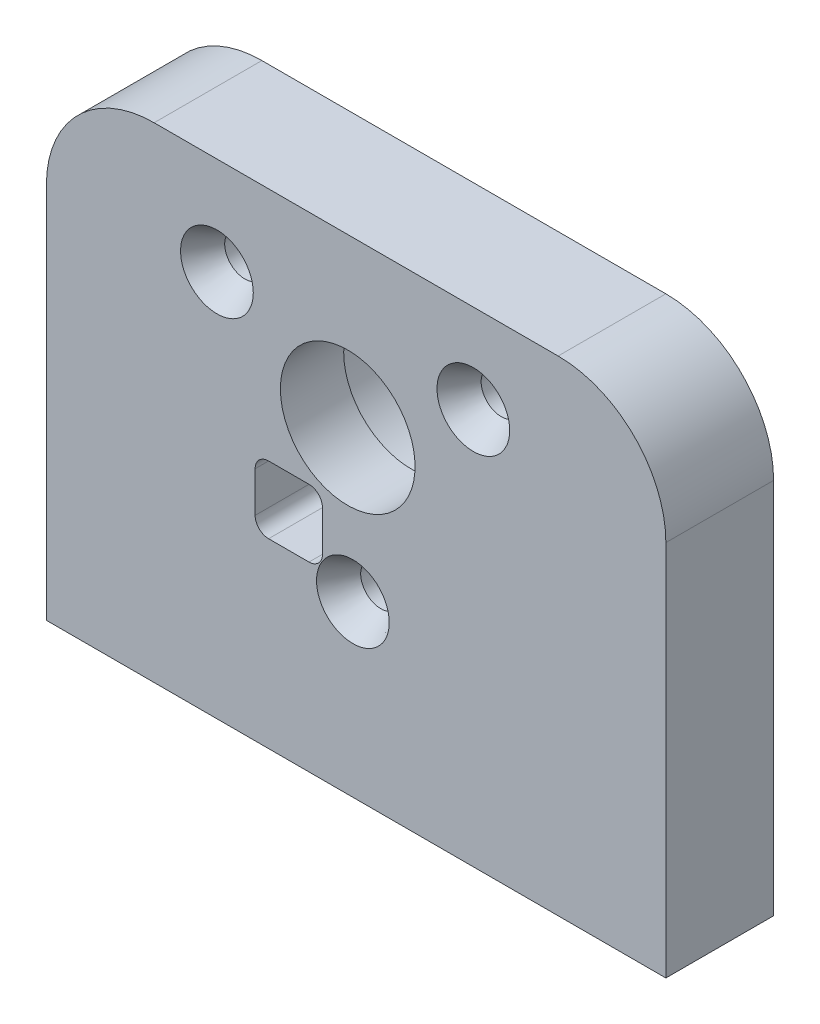
ISO-10303-21;
HEADER;
FILE_DESCRIPTION(('STEP AP214'),'2;1');
FILE_NAME('part.step','',(''),(''),'','','');
FILE_SCHEMA(('AUTOMOTIVE_DESIGN { 1 0 10303 214 1 1 1 1 }'));
ENDSEC;
DATA;
#1=APPLICATION_CONTEXT('core data for automotive mechanical design processes');
#2=APPLICATION_PROTOCOL_DEFINITION('international standard','automotive_design',2000,#1);
#3=PRODUCT_CONTEXT('',#1,'mechanical');
#4=PRODUCT('Part','Part','',(#3));
#5=PRODUCT_RELATED_PRODUCT_CATEGORY('part','',(#4));
#6=PRODUCT_DEFINITION_FORMATION('','',#4);
#7=PRODUCT_DEFINITION_CONTEXT('part definition',#1,'design');
#8=PRODUCT_DEFINITION('design','',#6,#7);
#9=PRODUCT_DEFINITION_SHAPE('','',#8);
#10=(LENGTH_UNIT() NAMED_UNIT(*) SI_UNIT(.MILLI.,.METRE.));
#11=(NAMED_UNIT(*) PLANE_ANGLE_UNIT() SI_UNIT($,.RADIAN.));
#12=(NAMED_UNIT(*) SI_UNIT($,.STERADIAN.) SOLID_ANGLE_UNIT());
#13=UNCERTAINTY_MEASURE_WITH_UNIT(LENGTH_MEASURE(1.E-05),#10,'distance_accuracy_value','');
#14=(GEOMETRIC_REPRESENTATION_CONTEXT(3) GLOBAL_UNCERTAINTY_ASSIGNED_CONTEXT((#13)) GLOBAL_UNIT_ASSIGNED_CONTEXT((#10,
#11,#12)) REPRESENTATION_CONTEXT('',''));
#15=CARTESIAN_POINT('',(0.,0.,0.));
#16=DIRECTION('',(0.,0.,1.));
#17=DIRECTION('',(1.,0.,0.));
#18=AXIS2_PLACEMENT_3D('',#15,#16,#17);
#19=CARTESIAN_POINT('',(-23.,18.,-3.5));
#20=DIRECTION('',(-1.,0.,0.));
#21=DIRECTION('',(0.,0.,1.));
#22=AXIS2_PLACEMENT_3D('',#19,#20,#21);
#23=PLANE('',#22);
#24=DIRECTION('',(0.,-1.,0.));
#25=VECTOR('',#24,1.);
#26=CARTESIAN_POINT('',(-23.,18.,4.5));
#27=LINE('',#26,#25);
#28=CARTESIAN_POINT('',(-23.,10.,4.5));
#29=VERTEX_POINT('',#28);
#30=CARTESIAN_POINT('',(-23.,-18.,4.5));
#31=VERTEX_POINT('',#30);
#32=EDGE_CURVE('E175',#29,#31,#27,.T.);
#33=ORIENTED_EDGE('',*,*,#32,.F.);
#34=DIRECTION('',(0.,0.,1.));
#35=VECTOR('',#34,1.);
#36=CARTESIAN_POINT('',(-23.,10.,-3.5));
#37=LINE('',#36,#35);
#38=CARTESIAN_POINT('',(-23.,10.,-3.5));
#39=VERTEX_POINT('',#38);
#40=EDGE_CURVE('E211',#29,#39,#37,.F.);
#41=ORIENTED_EDGE('',*,*,#40,.T.);
#42=DIRECTION('',(0.,-1.,0.));
#43=VECTOR('',#42,1.);
#44=CARTESIAN_POINT('',(-23.,18.,-3.5));
#45=LINE('',#44,#43);
#46=CARTESIAN_POINT('',(-23.,-18.,-3.5));
#47=VERTEX_POINT('',#46);
#48=EDGE_CURVE('E176',#39,#47,#45,.T.);
#49=ORIENTED_EDGE('',*,*,#48,.T.);
#50=DIRECTION('',(0.,0.,1.));
#51=VECTOR('',#50,1.);
#52=CARTESIAN_POINT('',(-23.,-18.,-3.5));
#53=LINE('',#52,#51);
#54=EDGE_CURVE('E188',#47,#31,#53,.T.);
#55=ORIENTED_EDGE('',*,*,#54,.T.);
#56=EDGE_LOOP('',(#33,#41,#49,#55));
#57=FACE_BOUND('',#56,.T.);
#58=ADVANCED_FACE('F37',(#57),#23,.T.);
#59=CARTESIAN_POINT('',(23.,18.,-3.5));
#60=DIRECTION('',(0.,1.,0.));
#61=DIRECTION('',(0.,0.,1.));
#62=AXIS2_PLACEMENT_3D('',#59,#60,#61);
#63=PLANE('',#62);
#64=DIRECTION('',(-1.,0.,0.));
#65=VECTOR('',#64,1.);
#66=CARTESIAN_POINT('',(23.,18.,-3.5));
#67=LINE('',#66,#65);
#68=CARTESIAN_POINT('',(15.,18.,-3.5));
#69=VERTEX_POINT('',#68);
#70=CARTESIAN_POINT('',(-15.,18.,-3.5));
#71=VERTEX_POINT('',#70);
#72=EDGE_CURVE('E185',#69,#71,#67,.T.);
#73=ORIENTED_EDGE('',*,*,#72,.T.);
#74=DIRECTION('',(0.,0.,1.));
#75=VECTOR('',#74,1.);
#76=CARTESIAN_POINT('',(-15.,18.,-3.5));
#77=LINE('',#76,#75);
#78=CARTESIAN_POINT('',(-15.,18.,4.5));
#79=VERTEX_POINT('',#78);
#80=EDGE_CURVE('E204',#71,#79,#77,.T.);
#81=ORIENTED_EDGE('',*,*,#80,.T.);
#82=DIRECTION('',(-1.,0.,0.));
#83=VECTOR('',#82,1.);
#84=CARTESIAN_POINT('',(23.,18.,4.5));
#85=LINE('',#84,#83);
#86=CARTESIAN_POINT('',(15.,18.,4.5));
#87=VERTEX_POINT('',#86);
#88=EDGE_CURVE('E179',#87,#79,#85,.T.);
#89=ORIENTED_EDGE('',*,*,#88,.F.);
#90=DIRECTION('',(0.,0.,1.));
#91=VECTOR('',#90,1.);
#92=CARTESIAN_POINT('',(15.,18.,-3.5));
#93=LINE('',#92,#91);
#94=EDGE_CURVE('E200',#87,#69,#93,.F.);
#95=ORIENTED_EDGE('',*,*,#94,.T.);
#96=EDGE_LOOP('',(#73,#81,#89,#95));
#97=FACE_BOUND('',#96,.T.);
#98=ADVANCED_FACE('F358',(#97),#63,.T.);
#99=CARTESIAN_POINT('',(23.,-18.,-3.5));
#100=DIRECTION('',(1.,0.,0.));
#101=DIRECTION('',(0.,0.,-1.));
#102=AXIS2_PLACEMENT_3D('',#99,#100,#101);
#103=PLANE('',#102);
#104=DIRECTION('',(0.,1.,0.));
#105=VECTOR('',#104,1.);
#106=CARTESIAN_POINT('',(23.,-18.,-3.5));
#107=LINE('',#106,#105);
#108=CARTESIAN_POINT('',(23.,-18.,-3.5));
#109=VERTEX_POINT('',#108);
#110=CARTESIAN_POINT('',(23.,10.,-3.5));
#111=VERTEX_POINT('',#110);
#112=EDGE_CURVE('E182',#109,#111,#107,.T.);
#113=ORIENTED_EDGE('',*,*,#112,.T.);
#114=DIRECTION('',(0.,0.,1.));
#115=VECTOR('',#114,1.);
#116=CARTESIAN_POINT('',(23.,10.,-3.5));
#117=LINE('',#116,#115);
#118=CARTESIAN_POINT('',(23.,10.,4.5));
#119=VERTEX_POINT('',#118);
#120=EDGE_CURVE('E217',#111,#119,#117,.T.);
#121=ORIENTED_EDGE('',*,*,#120,.T.);
#122=DIRECTION('',(0.,1.,0.));
#123=VECTOR('',#122,1.);
#124=CARTESIAN_POINT('',(23.,-18.,4.5));
#125=LINE('',#124,#123);
#126=CARTESIAN_POINT('',(23.,-18.,4.5));
#127=VERTEX_POINT('',#126);
#128=EDGE_CURVE('E193',#127,#119,#125,.T.);
#129=ORIENTED_EDGE('',*,*,#128,.F.);
#130=DIRECTION('',(0.,0.,1.));
#131=VECTOR('',#130,1.);
#132=CARTESIAN_POINT('',(23.,-18.,-3.5));
#133=LINE('',#132,#131);
#134=EDGE_CURVE('E198',#109,#127,#133,.T.);
#135=ORIENTED_EDGE('',*,*,#134,.F.);
#136=EDGE_LOOP('',(#113,#121,#129,#135));
#137=FACE_BOUND('',#136,.T.);
#138=ADVANCED_FACE('F370',(#137),#103,.T.);
#139=CARTESIAN_POINT('',(-23.,-18.,-3.5));
#140=DIRECTION('',(0.,-1.,0.));
#141=DIRECTION('',(0.,0.,-1.));
#142=AXIS2_PLACEMENT_3D('',#139,#140,#141);
#143=PLANE('',#142);
#144=CARTESIAN_POINT('',(19.,-18.,0.5));
#145=DIRECTION('',(0.,-1.,0.));
#146=DIRECTION('',(0.,0.,-1.));
#147=AXIS2_PLACEMENT_3D('',#144,#145,#146);
#148=CIRCLE('',#147,1.24999999999999);
#149=CARTESIAN_POINT('',(19.,-18.,-0.749999999999991));
#150=VERTEX_POINT('',#149);
#151=EDGE_CURVE('E157',#150,#150,#148,.T.);
#152=ORIENTED_EDGE('',*,*,#151,.F.);
#153=EDGE_LOOP('',(#152));
#154=FACE_BOUND('',#153,.T.);
#155=CARTESIAN_POINT('',(-19.,-18.,0.5));
#156=DIRECTION('',(0.,-1.,0.));
#157=DIRECTION('',(0.,0.,-1.));
#158=AXIS2_PLACEMENT_3D('',#155,#156,#157);
#159=CIRCLE('',#158,1.24999999999999);
#160=CARTESIAN_POINT('',(-19.,-18.,-0.749999999999991));
#161=VERTEX_POINT('',#160);
#162=EDGE_CURVE('E156',#161,#161,#159,.T.);
#163=ORIENTED_EDGE('',*,*,#162,.F.);
#164=EDGE_LOOP('',(#163));
#165=FACE_BOUND('',#164,.T.);
#166=CARTESIAN_POINT('',(0.,-18.,0.5));
#167=DIRECTION('',(0.,-1.,0.));
#168=DIRECTION('',(0.,0.,-1.));
#169=AXIS2_PLACEMENT_3D('',#166,#167,#168);
#170=CIRCLE('',#169,1.24999999999999);
#171=CARTESIAN_POINT('',(0.,-18.,-0.749999999999989));
#172=VERTEX_POINT('',#171);
#173=EDGE_CURVE('E169',#172,#172,#170,.T.);
#174=ORIENTED_EDGE('',*,*,#173,.F.);
#175=EDGE_LOOP('',(#174));
#176=FACE_BOUND('',#175,.T.);
#177=DIRECTION('',(1.,0.,0.));
#178=VECTOR('',#177,1.);
#179=CARTESIAN_POINT('',(-23.,-18.,4.5));
#180=LINE('',#179,#178);
#181=EDGE_CURVE('E190',#31,#127,#180,.T.);
#182=ORIENTED_EDGE('',*,*,#181,.F.);
#183=ORIENTED_EDGE('',*,*,#54,.F.);
#184=DIRECTION('',(1.,0.,0.));
#185=VECTOR('',#184,1.);
#186=CARTESIAN_POINT('',(-23.,-18.,-3.5));
#187=LINE('',#186,#185);
#188=EDGE_CURVE('E178',#47,#109,#187,.T.);
#189=ORIENTED_EDGE('',*,*,#188,.T.);
#190=ORIENTED_EDGE('',*,*,#134,.T.);
#191=EDGE_LOOP('',(#182,#183,#189,#190));
#192=FACE_BOUND('',#191,.T.);
#193=ADVANCED_FACE('F374',(#154,#165,#176,#192),#143,.T.);
#194=CARTESIAN_POINT('',(0.,0.,-3.5));
#195=DIRECTION('',(0.,0.,1.));
#196=DIRECTION('',(1.,0.,0.));
#197=AXIS2_PLACEMENT_3D('',#194,#195,#196);
#198=PLANE('',#197);
#199=CARTESIAN_POINT('',(-10.3374235218715,10.7419094739837,-3.5));
#200=DIRECTION('',(0.,0.,1.));
#201=DIRECTION('',(1.,0.,0.));
#202=AXIS2_PLACEMENT_3D('',#199,#200,#201);
#203=CIRCLE('',#202,1.49999999999999);
#204=CARTESIAN_POINT('',(-8.83742352187153,10.7419094739837,-3.5));
#205=VERTEX_POINT('',#204);
#206=EDGE_CURVE('E41',#205,#205,#203,.T.);
#207=ORIENTED_EDGE('',*,*,#206,.T.);
#208=EDGE_LOOP('',(#207));
#209=FACE_BOUND('',#208,.T.);
#210=CARTESIAN_POINT('',(8.70352905812721,11.4068341899332,-3.5));
#211=DIRECTION('',(0.,0.,1.));
#212=DIRECTION('',(1.,0.,0.));
#213=AXIS2_PLACEMENT_3D('',#210,#211,#212);
#214=CIRCLE('',#213,1.49999999999999);
#215=CARTESIAN_POINT('',(10.2035290581272,11.4068341899332,-3.5));
#216=VERTEX_POINT('',#215);
#217=EDGE_CURVE('E261',#216,#216,#214,.T.);
#218=ORIENTED_EDGE('',*,*,#217,.T.);
#219=EDGE_LOOP('',(#218));
#220=FACE_BOUND('',#219,.T.);
#221=CARTESIAN_POINT('',(-0.241105536255778,-5.41557681457532,-3.5));
#222=DIRECTION('',(0.,0.,1.));
#223=DIRECTION('',(1.,0.,0.));
#224=AXIS2_PLACEMENT_3D('',#221,#222,#223);
#225=CIRCLE('',#224,1.49999999999999);
#226=CARTESIAN_POINT('',(1.25889446374422,-5.41557681457532,-3.5));
#227=VERTEX_POINT('',#226);
#228=EDGE_CURVE('E257',#227,#227,#225,.T.);
#229=ORIENTED_EDGE('',*,*,#228,.T.);
#230=EDGE_LOOP('',(#229));
#231=FACE_BOUND('',#230,.T.);
#232=CARTESIAN_POINT('',(-0.625000000000027,5.57772228311385,-3.5));
#233=DIRECTION('',(0.,0.,-1.));
#234=DIRECTION('',(-1.,0.,0.));
#235=AXIS2_PLACEMENT_3D('',#232,#233,#234);
#236=CIRCLE('',#235,6.00000000000001);
#237=CARTESIAN_POINT('',(-6.62500000000004,5.57772228311385,-3.5));
#238=VERTEX_POINT('',#237);
#239=EDGE_CURVE('E259',#238,#238,#236,.T.);
#240=ORIENTED_EDGE('',*,*,#239,.F.);
#241=EDGE_LOOP('',(#240));
#242=FACE_BOUND('',#241,.T.);
#243=CARTESIAN_POINT('',(-5.,-2.,-3.5));
#244=DIRECTION('',(0.,0.,-1.));
#245=DIRECTION('',(-1.,0.,0.));
#246=AXIS2_PLACEMENT_3D('',#243,#244,#245);
#247=CIRCLE('',#246,2.65);
#248=CARTESIAN_POINT('',(-7.65,-2.,-3.5));
#249=VERTEX_POINT('',#248);
#250=EDGE_CURVE('E291',#249,#249,#247,.T.);
#251=ORIENTED_EDGE('',*,*,#250,.F.);
#252=EDGE_LOOP('',(#251));
#253=FACE_BOUND('',#252,.T.);
#254=ORIENTED_EDGE('',*,*,#48,.F.);
#255=CARTESIAN_POINT('',(-15.,10.,-3.5));
#256=DIRECTION('',(0.,0.,1.));
#257=DIRECTION('',(1.,0.,0.));
#258=AXIS2_PLACEMENT_3D('',#255,#256,#257);
#259=CIRCLE('',#258,8.);
#260=EDGE_CURVE('E215',#39,#71,#259,.F.);
#261=ORIENTED_EDGE('',*,*,#260,.T.);
#262=ORIENTED_EDGE('',*,*,#72,.F.);
#263=CARTESIAN_POINT('',(15.,10.,-3.5));
#264=DIRECTION('',(0.,0.,1.));
#265=DIRECTION('',(1.,0.,0.));
#266=AXIS2_PLACEMENT_3D('',#263,#264,#265);
#267=CIRCLE('',#266,8.);
#268=EDGE_CURVE('E213',#69,#111,#267,.F.);
#269=ORIENTED_EDGE('',*,*,#268,.T.);
#270=ORIENTED_EDGE('',*,*,#112,.F.);
#271=ORIENTED_EDGE('',*,*,#188,.F.);
#272=EDGE_LOOP('',(#254,#261,#262,#269,#270,#271));
#273=FACE_BOUND('',#272,.T.);
#274=ADVANCED_FACE('F351',(#209,#220,#231,#242,#253,#273),#198,.F.);
#275=CARTESIAN_POINT('',(0.,0.,4.5));
#276=DIRECTION('',(0.,0.,1.));
#277=DIRECTION('',(1.,0.,0.));
#278=AXIS2_PLACEMENT_3D('',#275,#276,#277);
#279=PLANE('',#278);
#280=CARTESIAN_POINT('',(-10.3374235218715,10.7419094739837,4.5));
#281=DIRECTION('',(0.,0.,1.));
#282=DIRECTION('',(1.,0.,0.));
#283=AXIS2_PLACEMENT_3D('',#280,#281,#282);
#284=CIRCLE('',#283,2.7);
#285=CARTESIAN_POINT('',(-7.63742352187152,10.7419094739837,4.5));
#286=VERTEX_POINT('',#285);
#287=EDGE_CURVE('E641',#286,#286,#284,.T.);
#288=ORIENTED_EDGE('',*,*,#287,.F.);
#289=EDGE_LOOP('',(#288));
#290=FACE_BOUND('',#289,.T.);
#291=CARTESIAN_POINT('',(8.70352905812721,11.4068341899332,4.5));
#292=DIRECTION('',(0.,0.,1.));
#293=DIRECTION('',(1.,0.,0.));
#294=AXIS2_PLACEMENT_3D('',#291,#292,#293);
#295=CIRCLE('',#294,2.7);
#296=CARTESIAN_POINT('',(11.4035290581272,11.4068341899332,4.5));
#297=VERTEX_POINT('',#296);
#298=EDGE_CURVE('E270',#297,#297,#295,.T.);
#299=ORIENTED_EDGE('',*,*,#298,.F.);
#300=EDGE_LOOP('',(#299));
#301=FACE_BOUND('',#300,.T.);
#302=CARTESIAN_POINT('',(-0.241105536255778,-5.41557681457532,4.5));
#303=DIRECTION('',(0.,0.,1.));
#304=DIRECTION('',(1.,0.,0.));
#305=AXIS2_PLACEMENT_3D('',#302,#303,#304);
#306=CIRCLE('',#305,2.7);
#307=CARTESIAN_POINT('',(2.45889446374422,-5.41557681457532,4.5));
#308=VERTEX_POINT('',#307);
#309=EDGE_CURVE('E263',#308,#308,#306,.T.);
#310=ORIENTED_EDGE('',*,*,#309,.F.);
#311=EDGE_LOOP('',(#310));
#312=FACE_BOUND('',#311,.T.);
#313=CARTESIAN_POINT('',(-0.625000000000027,5.57772228311385,4.5));
#314=DIRECTION('',(0.,0.,-1.));
#315=DIRECTION('',(-1.,0.,0.));
#316=AXIS2_PLACEMENT_3D('',#313,#314,#315);
#317=CIRCLE('',#316,5.00000000000001);
#318=CARTESIAN_POINT('',(-5.62500000000004,5.57772228311385,4.5));
#319=VERTEX_POINT('',#318);
#320=EDGE_CURVE('E288',#319,#319,#317,.T.);
#321=ORIENTED_EDGE('',*,*,#320,.T.);
#322=EDGE_LOOP('',(#321));
#323=FACE_BOUND('',#322,.T.);
#324=DIRECTION('',(0.,1.,0.));
#325=VECTOR('',#324,1.);
#326=CARTESIAN_POINT('',(-2.5,-4.5,4.5));
#327=LINE('',#326,#325);
#328=CARTESIAN_POINT('',(-2.5,-3.5,4.5));
#329=VERTEX_POINT('',#328);
#330=CARTESIAN_POINT('',(-2.5,-0.500000000000002,4.5));
#331=VERTEX_POINT('',#330);
#332=EDGE_CURVE('E224',#329,#331,#327,.T.);
#333=ORIENTED_EDGE('',*,*,#332,.F.);
#334=CARTESIAN_POINT('',(-3.5,-3.5,4.5));
#335=DIRECTION('',(0.,0.,1.));
#336=DIRECTION('',(1.,0.,0.));
#337=AXIS2_PLACEMENT_3D('',#334,#335,#336);
#338=CIRCLE('',#337,1.);
#339=CARTESIAN_POINT('',(-3.5,-4.5,4.5));
#340=VERTEX_POINT('',#339);
#341=EDGE_CURVE('E254',#329,#340,#338,.F.);
#342=ORIENTED_EDGE('',*,*,#341,.T.);
#343=DIRECTION('',(1.,0.,0.));
#344=VECTOR('',#343,1.);
#345=CARTESIAN_POINT('',(-7.5,-4.5,4.5));
#346=LINE('',#345,#344);
#347=CARTESIAN_POINT('',(-6.5,-4.5,4.5));
#348=VERTEX_POINT('',#347);
#349=EDGE_CURVE('E300',#348,#340,#346,.T.);
#350=ORIENTED_EDGE('',*,*,#349,.F.);
#351=CARTESIAN_POINT('',(-6.5,-3.5,4.5));
#352=DIRECTION('',(0.,0.,1.));
#353=DIRECTION('',(1.,0.,0.));
#354=AXIS2_PLACEMENT_3D('',#351,#352,#353);
#355=CIRCLE('',#354,1.);
#356=CARTESIAN_POINT('',(-7.5,-3.5,4.5));
#357=VERTEX_POINT('',#356);
#358=EDGE_CURVE('E252',#348,#357,#355,.F.);
#359=ORIENTED_EDGE('',*,*,#358,.T.);
#360=DIRECTION('',(0.,-1.,0.));
#361=VECTOR('',#360,1.);
#362=CARTESIAN_POINT('',(-7.5,-4.5,4.5));
#363=LINE('',#362,#361);
#364=CARTESIAN_POINT('',(-7.5,-0.500000000000002,4.5));
#365=VERTEX_POINT('',#364);
#366=EDGE_CURVE('E312',#365,#357,#363,.T.);
#367=ORIENTED_EDGE('',*,*,#366,.F.);
#368=CARTESIAN_POINT('',(-6.5,-0.500000000000002,4.5));
#369=DIRECTION('',(0.,0.,1.));
#370=DIRECTION('',(1.,0.,0.));
#371=AXIS2_PLACEMENT_3D('',#368,#369,#370);
#372=CIRCLE('',#371,1.);
#373=CARTESIAN_POINT('',(-6.5,0.499999999999998,4.5));
#374=VERTEX_POINT('',#373);
#375=EDGE_CURVE('E11',#365,#374,#372,.F.);
#376=ORIENTED_EDGE('',*,*,#375,.T.);
#377=DIRECTION('',(-1.,0.,0.));
#378=VECTOR('',#377,1.);
#379=CARTESIAN_POINT('',(-7.5,0.499999999999998,4.5));
#380=LINE('',#379,#378);
#381=CARTESIAN_POINT('',(-3.5,0.499999999999998,4.5));
#382=VERTEX_POINT('',#381);
#383=EDGE_CURVE('E310',#382,#374,#380,.T.);
#384=ORIENTED_EDGE('',*,*,#383,.F.);
#385=CARTESIAN_POINT('',(-3.5,-0.500000000000002,4.5));
#386=DIRECTION('',(0.,0.,1.));
#387=DIRECTION('',(1.,0.,0.));
#388=AXIS2_PLACEMENT_3D('',#385,#386,#387);
#389=CIRCLE('',#388,1.);
#390=EDGE_CURVE('E46',#382,#331,#389,.F.);
#391=ORIENTED_EDGE('',*,*,#390,.T.);
#392=EDGE_LOOP('',(#333,#342,#350,#359,#367,#376,#384,#391));
#393=FACE_BOUND('',#392,.T.);
#394=ORIENTED_EDGE('',*,*,#88,.T.);
#395=CARTESIAN_POINT('',(-15.,10.,4.5));
#396=DIRECTION('',(0.,0.,1.));
#397=DIRECTION('',(1.,0.,0.));
#398=AXIS2_PLACEMENT_3D('',#395,#396,#397);
#399=CIRCLE('',#398,8.);
#400=EDGE_CURVE('E209',#79,#29,#399,.T.);
#401=ORIENTED_EDGE('',*,*,#400,.T.);
#402=ORIENTED_EDGE('',*,*,#32,.T.);
#403=ORIENTED_EDGE('',*,*,#181,.T.);
#404=ORIENTED_EDGE('',*,*,#128,.T.);
#405=CARTESIAN_POINT('',(15.,10.,4.5));
#406=DIRECTION('',(0.,0.,1.));
#407=DIRECTION('',(1.,0.,0.));
#408=AXIS2_PLACEMENT_3D('',#405,#406,#407);
#409=CIRCLE('',#408,8.);
#410=EDGE_CURVE('E207',#119,#87,#409,.T.);
#411=ORIENTED_EDGE('',*,*,#410,.T.);
#412=EDGE_LOOP('',(#394,#401,#402,#403,#404,#411));
#413=FACE_BOUND('',#412,.T.);
#414=ADVANCED_FACE('F347',(#290,#301,#312,#323,#393,#413),#279,.T.);
#415=CARTESIAN_POINT('',(0.,-10.5,0.5));
#416=DIRECTION('',(0.,-1.,0.));
#417=DIRECTION('',(0.,0.,-1.));
#418=AXIS2_PLACEMENT_3D('',#415,#416,#417);
#419=CONICAL_SURFACE('',#418,1.24999999999999,1.02974425867665);
#420=CARTESIAN_POINT('',(0.,-9.74892422621555,0.5));
#421=VERTEX_POINT('',#420);
#422=VERTEX_LOOP('',#421);
#423=FACE_BOUND('',#422,.T.);
#424=CARTESIAN_POINT('',(0.,-10.5,0.5));
#425=DIRECTION('',(0.,-1.,0.));
#426=DIRECTION('',(0.,0.,-1.));
#427=AXIS2_PLACEMENT_3D('',#424,#425,#426);
#428=CIRCLE('',#427,1.24999999999999);
#429=CARTESIAN_POINT('',(0.,-10.5,-0.749999999999987));
#430=VERTEX_POINT('',#429);
#431=EDGE_CURVE('E172',#430,#430,#428,.T.);
#432=ORIENTED_EDGE('',*,*,#431,.T.);
#433=EDGE_LOOP('',(#432));
#434=FACE_BOUND('',#433,.T.);
#435=ADVANCED_FACE('F350',(#423,#434),#419,.F.);
#436=CARTESIAN_POINT('',(0.,-18.,0.5));
#437=DIRECTION('',(0.,-1.,0.));
#438=DIRECTION('',(0.,0.,-1.));
#439=AXIS2_PLACEMENT_3D('',#436,#437,#438);
#440=CYLINDRICAL_SURFACE('',#439,1.24999999999999);
#441=ORIENTED_EDGE('',*,*,#431,.F.);
#442=EDGE_LOOP('',(#441));
#443=FACE_BOUND('',#442,.T.);
#444=ORIENTED_EDGE('',*,*,#173,.T.);
#445=EDGE_LOOP('',(#444));
#446=FACE_BOUND('',#445,.T.);
#447=ADVANCED_FACE('F445',(#443,#446),#440,.F.);
#448=CARTESIAN_POINT('',(-19.,-10.5,0.5));
#449=DIRECTION('',(0.,-1.,0.));
#450=DIRECTION('',(0.,0.,-1.));
#451=AXIS2_PLACEMENT_3D('',#448,#449,#450);
#452=CONICAL_SURFACE('',#451,1.24999999999999,1.02974425867664);
#453=CARTESIAN_POINT('',(-19.,-9.74892422621555,0.5));
#454=VERTEX_POINT('',#453);
#455=VERTEX_LOOP('',#454);
#456=FACE_BOUND('',#455,.T.);
#457=CARTESIAN_POINT('',(-19.,-10.5,0.5));
#458=DIRECTION('',(0.,-1.,0.));
#459=DIRECTION('',(0.,0.,-1.));
#460=AXIS2_PLACEMENT_3D('',#457,#458,#459);
#461=CIRCLE('',#460,1.24999999999999);
#462=CARTESIAN_POINT('',(-19.,-10.5,-0.749999999999987));
#463=VERTEX_POINT('',#462);
#464=EDGE_CURVE('E160',#463,#463,#461,.T.);
#465=ORIENTED_EDGE('',*,*,#464,.T.);
#466=EDGE_LOOP('',(#465));
#467=FACE_BOUND('',#466,.T.);
#468=ADVANCED_FACE('F441',(#456,#467),#452,.F.);
#469=CARTESIAN_POINT('',(-19.,-18.,0.5));
#470=DIRECTION('',(0.,-1.,0.));
#471=DIRECTION('',(0.,0.,-1.));
#472=AXIS2_PLACEMENT_3D('',#469,#470,#471);
#473=CYLINDRICAL_SURFACE('',#472,1.24999999999999);
#474=ORIENTED_EDGE('',*,*,#464,.F.);
#475=EDGE_LOOP('',(#474));
#476=FACE_BOUND('',#475,.T.);
#477=ORIENTED_EDGE('',*,*,#162,.T.);
#478=EDGE_LOOP('',(#477));
#479=FACE_BOUND('',#478,.T.);
#480=ADVANCED_FACE('F150',(#476,#479),#473,.F.);
#481=CARTESIAN_POINT('',(19.,-10.5,0.5));
#482=DIRECTION('',(0.,-1.,0.));
#483=DIRECTION('',(0.,0.,-1.));
#484=AXIS2_PLACEMENT_3D('',#481,#482,#483);
#485=CONICAL_SURFACE('',#484,1.24999999999999,1.02974425867664);
#486=CARTESIAN_POINT('',(19.,-9.74892422621555,0.5));
#487=VERTEX_POINT('',#486);
#488=VERTEX_LOOP('',#487);
#489=FACE_BOUND('',#488,.T.);
#490=CARTESIAN_POINT('',(19.,-10.5,0.5));
#491=DIRECTION('',(0.,-1.,0.));
#492=DIRECTION('',(0.,0.,-1.));
#493=AXIS2_PLACEMENT_3D('',#490,#491,#492);
#494=CIRCLE('',#493,1.24999999999999);
#495=CARTESIAN_POINT('',(19.,-10.5,-0.749999999999987));
#496=VERTEX_POINT('',#495);
#497=EDGE_CURVE('E154',#496,#496,#494,.T.);
#498=ORIENTED_EDGE('',*,*,#497,.T.);
#499=EDGE_LOOP('',(#498));
#500=FACE_BOUND('',#499,.T.);
#501=ADVANCED_FACE('F146',(#489,#500),#485,.F.);
#502=CARTESIAN_POINT('',(19.,-18.,0.5));
#503=DIRECTION('',(0.,-1.,0.));
#504=DIRECTION('',(0.,0.,-1.));
#505=AXIS2_PLACEMENT_3D('',#502,#503,#504);
#506=CYLINDRICAL_SURFACE('',#505,1.24999999999999);
#507=ORIENTED_EDGE('',*,*,#497,.F.);
#508=EDGE_LOOP('',(#507));
#509=FACE_BOUND('',#508,.T.);
#510=ORIENTED_EDGE('',*,*,#151,.T.);
#511=EDGE_LOOP('',(#510));
#512=FACE_BOUND('',#511,.T.);
#513=ADVANCED_FACE('F149',(#509,#512),#506,.F.);
#514=CARTESIAN_POINT('',(-15.,10.,-3.5));
#515=DIRECTION('',(0.,0.,1.));
#516=DIRECTION('',(1.,0.,0.));
#517=AXIS2_PLACEMENT_3D('',#514,#515,#516);
#518=CYLINDRICAL_SURFACE('',#517,8.);
#519=ORIENTED_EDGE('',*,*,#260,.F.);
#520=ORIENTED_EDGE('',*,*,#40,.F.);
#521=ORIENTED_EDGE('',*,*,#400,.F.);
#522=ORIENTED_EDGE('',*,*,#80,.F.);
#523=EDGE_LOOP('',(#519,#520,#521,#522));
#524=FACE_BOUND('',#523,.T.);
#525=ADVANCED_FACE('F380',(#524),#518,.T.);
#526=CARTESIAN_POINT('',(15.,10.,-3.5));
#527=DIRECTION('',(0.,0.,1.));
#528=DIRECTION('',(1.,0.,0.));
#529=AXIS2_PLACEMENT_3D('',#526,#527,#528);
#530=CYLINDRICAL_SURFACE('',#529,8.);
#531=ORIENTED_EDGE('',*,*,#268,.F.);
#532=ORIENTED_EDGE('',*,*,#94,.F.);
#533=ORIENTED_EDGE('',*,*,#410,.F.);
#534=ORIENTED_EDGE('',*,*,#120,.F.);
#535=EDGE_LOOP('',(#531,#532,#533,#534));
#536=FACE_BOUND('',#535,.T.);
#537=ADVANCED_FACE('F363',(#536),#530,.T.);
#538=CARTESIAN_POINT('',(-2.5,-4.5,0.));
#539=DIRECTION('',(1.,0.,0.));
#540=DIRECTION('',(0.,0.,-1.));
#541=AXIS2_PLACEMENT_3D('',#538,#539,#540);
#542=PLANE('',#541);
#543=DIRECTION('',(0.,1.,0.));
#544=VECTOR('',#543,1.);
#545=CARTESIAN_POINT('',(-2.5,-4.5,0.));
#546=LINE('',#545,#544);
#547=CARTESIAN_POINT('',(-2.5,-3.5,0.));
#548=VERTEX_POINT('',#547);
#549=CARTESIAN_POINT('',(-2.5,-0.500000000000002,0.));
#550=VERTEX_POINT('',#549);
#551=EDGE_CURVE('E296',#548,#550,#546,.T.);
#552=ORIENTED_EDGE('',*,*,#551,.F.);
#553=DIRECTION('',(0.,0.,1.));
#554=VECTOR('',#553,1.);
#555=CARTESIAN_POINT('',(-2.5,-3.5,4.5));
#556=LINE('',#555,#554);
#557=EDGE_CURVE('E245',#548,#329,#556,.T.);
#558=ORIENTED_EDGE('',*,*,#557,.T.);
#559=ORIENTED_EDGE('',*,*,#332,.T.);
#560=DIRECTION('',(0.,0.,1.));
#561=VECTOR('',#560,1.);
#562=CARTESIAN_POINT('',(-2.5,-0.500000000000002,0.));
#563=LINE('',#562,#561);
#564=EDGE_CURVE('E243',#331,#550,#563,.F.);
#565=ORIENTED_EDGE('',*,*,#564,.T.);
#566=EDGE_LOOP('',(#552,#558,#559,#565));
#567=FACE_BOUND('',#566,.T.);
#568=ADVANCED_FACE('F330',(#567),#542,.F.);
#569=CARTESIAN_POINT('',(-7.5,-4.5,0.));
#570=DIRECTION('',(0.,-1.,0.));
#571=DIRECTION('',(0.,0.,-1.));
#572=AXIS2_PLACEMENT_3D('',#569,#570,#571);
#573=PLANE('',#572);
#574=DIRECTION('',(1.,0.,0.));
#575=VECTOR('',#574,1.);
#576=CARTESIAN_POINT('',(-7.5,-4.5,0.));
#577=LINE('',#576,#575);
#578=CARTESIAN_POINT('',(-6.5,-4.5,0.));
#579=VERTEX_POINT('',#578);
#580=CARTESIAN_POINT('',(-3.5,-4.5,0.));
#581=VERTEX_POINT('',#580);
#582=EDGE_CURVE('E163',#579,#581,#577,.T.);
#583=ORIENTED_EDGE('',*,*,#582,.F.);
#584=DIRECTION('',(0.,0.,1.));
#585=VECTOR('',#584,1.);
#586=CARTESIAN_POINT('',(-6.5,-4.5,4.5));
#587=LINE('',#586,#585);
#588=EDGE_CURVE('E227',#579,#348,#587,.T.);
#589=ORIENTED_EDGE('',*,*,#588,.T.);
#590=ORIENTED_EDGE('',*,*,#349,.T.);
#591=DIRECTION('',(0.,0.,1.));
#592=VECTOR('',#591,1.);
#593=CARTESIAN_POINT('',(-3.5,-4.5,0.));
#594=LINE('',#593,#592);
#595=EDGE_CURVE('E220',#340,#581,#594,.F.);
#596=ORIENTED_EDGE('',*,*,#595,.T.);
#597=EDGE_LOOP('',(#583,#589,#590,#596));
#598=FACE_BOUND('',#597,.T.);
#599=ADVANCED_FACE('F319',(#598),#573,.F.);
#600=CARTESIAN_POINT('',(-7.5,-4.5,0.));
#601=DIRECTION('',(-1.,0.,0.));
#602=DIRECTION('',(0.,0.,1.));
#603=AXIS2_PLACEMENT_3D('',#600,#601,#602);
#604=PLANE('',#603);
#605=ORIENTED_EDGE('',*,*,#366,.T.);
#606=DIRECTION('',(0.,0.,1.));
#607=VECTOR('',#606,1.);
#608=CARTESIAN_POINT('',(-7.5,-3.5,0.));
#609=LINE('',#608,#607);
#610=CARTESIAN_POINT('',(-7.5,-3.5,0.));
#611=VERTEX_POINT('',#610);
#612=EDGE_CURVE('E233',#357,#611,#609,.F.);
#613=ORIENTED_EDGE('',*,*,#612,.T.);
#614=DIRECTION('',(0.,-1.,0.));
#615=VECTOR('',#614,1.);
#616=CARTESIAN_POINT('',(-7.5,-4.5,0.));
#617=LINE('',#616,#615);
#618=CARTESIAN_POINT('',(-7.5,-0.500000000000002,0.));
#619=VERTEX_POINT('',#618);
#620=EDGE_CURVE('E303',#619,#611,#617,.T.);
#621=ORIENTED_EDGE('',*,*,#620,.F.);
#622=DIRECTION('',(0.,0.,1.));
#623=VECTOR('',#622,1.);
#624=CARTESIAN_POINT('',(-7.5,-0.500000000000002,4.5));
#625=LINE('',#624,#623);
#626=EDGE_CURVE('E230',#619,#365,#625,.T.);
#627=ORIENTED_EDGE('',*,*,#626,.T.);
#628=EDGE_LOOP('',(#605,#613,#621,#627));
#629=FACE_BOUND('',#628,.T.);
#630=ADVANCED_FACE('F343',(#629),#604,.F.);
#631=CARTESIAN_POINT('',(-7.5,0.499999999999998,0.));
#632=DIRECTION('',(0.,1.,0.));
#633=DIRECTION('',(0.,0.,1.));
#634=AXIS2_PLACEMENT_3D('',#631,#632,#633);
#635=PLANE('',#634);
#636=DIRECTION('',(-1.,0.,0.));
#637=VECTOR('',#636,1.);
#638=CARTESIAN_POINT('',(-7.5,0.499999999999998,0.));
#639=LINE('',#638,#637);
#640=CARTESIAN_POINT('',(-3.5,0.499999999999998,0.));
#641=VERTEX_POINT('',#640);
#642=CARTESIAN_POINT('',(-6.5,0.499999999999998,0.));
#643=VERTEX_POINT('',#642);
#644=EDGE_CURVE('E299',#641,#643,#639,.T.);
#645=ORIENTED_EDGE('',*,*,#644,.F.);
#646=DIRECTION('',(0.,0.,1.));
#647=VECTOR('',#646,1.);
#648=CARTESIAN_POINT('',(-3.5,0.499999999999998,4.5));
#649=LINE('',#648,#647);
#650=EDGE_CURVE('E250',#641,#382,#649,.T.);
#651=ORIENTED_EDGE('',*,*,#650,.T.);
#652=ORIENTED_EDGE('',*,*,#383,.T.);
#653=DIRECTION('',(0.,0.,1.));
#654=VECTOR('',#653,1.);
#655=CARTESIAN_POINT('',(-6.5,0.499999999999998,0.));
#656=LINE('',#655,#654);
#657=EDGE_CURVE('E248',#374,#643,#656,.F.);
#658=ORIENTED_EDGE('',*,*,#657,.T.);
#659=EDGE_LOOP('',(#645,#651,#652,#658));
#660=FACE_BOUND('',#659,.T.);
#661=ADVANCED_FACE('F336',(#660),#635,.F.);
#662=CARTESIAN_POINT('',(0.,0.,0.));
#663=DIRECTION('',(0.,0.,-1.));
#664=DIRECTION('',(-1.,0.,0.));
#665=AXIS2_PLACEMENT_3D('',#662,#663,#664);
#666=PLANE('',#665);
#667=CARTESIAN_POINT('',(-5.,-2.,0.));
#668=DIRECTION('',(0.,0.,-1.));
#669=DIRECTION('',(-1.,0.,0.));
#670=AXIS2_PLACEMENT_3D('',#667,#668,#669);
#671=CIRCLE('',#670,1.49999999999999);
#672=CARTESIAN_POINT('',(-6.49999999999999,-2.,0.));
#673=VERTEX_POINT('',#672);
#674=EDGE_CURVE('E221',#673,#673,#671,.T.);
#675=ORIENTED_EDGE('',*,*,#674,.T.);
#676=EDGE_LOOP('',(#675));
#677=FACE_BOUND('',#676,.T.);
#678=ORIENTED_EDGE('',*,*,#620,.T.);
#679=CARTESIAN_POINT('',(-6.5,-3.5,0.));
#680=DIRECTION('',(0.,0.,-1.));
#681=DIRECTION('',(-1.,0.,0.));
#682=AXIS2_PLACEMENT_3D('',#679,#680,#681);
#683=CIRCLE('',#682,1.);
#684=EDGE_CURVE('E241',#611,#579,#683,.F.);
#685=ORIENTED_EDGE('',*,*,#684,.T.);
#686=ORIENTED_EDGE('',*,*,#582,.T.);
#687=CARTESIAN_POINT('',(-3.5,-3.5,0.));
#688=DIRECTION('',(0.,0.,-1.));
#689=DIRECTION('',(-1.,0.,0.));
#690=AXIS2_PLACEMENT_3D('',#687,#688,#689);
#691=CIRCLE('',#690,1.);
#692=EDGE_CURVE('E239',#581,#548,#691,.F.);
#693=ORIENTED_EDGE('',*,*,#692,.T.);
#694=ORIENTED_EDGE('',*,*,#551,.T.);
#695=CARTESIAN_POINT('',(-3.5,-0.500000000000002,0.));
#696=DIRECTION('',(0.,0.,-1.));
#697=DIRECTION('',(-1.,0.,0.));
#698=AXIS2_PLACEMENT_3D('',#695,#696,#697);
#699=CIRCLE('',#698,1.);
#700=EDGE_CURVE('E237',#550,#641,#699,.F.);
#701=ORIENTED_EDGE('',*,*,#700,.T.);
#702=ORIENTED_EDGE('',*,*,#644,.T.);
#703=CARTESIAN_POINT('',(-6.5,-0.500000000000002,0.));
#704=DIRECTION('',(0.,0.,-1.));
#705=DIRECTION('',(-1.,0.,0.));
#706=AXIS2_PLACEMENT_3D('',#703,#704,#705);
#707=CIRCLE('',#706,1.);
#708=EDGE_CURVE('E235',#643,#619,#707,.F.);
#709=ORIENTED_EDGE('',*,*,#708,.T.);
#710=EDGE_LOOP('',(#678,#685,#686,#693,#694,#701,#702,#709));
#711=FACE_BOUND('',#710,.T.);
#712=ADVANCED_FACE('F327',(#677,#711),#666,.F.);
#713=CARTESIAN_POINT('',(-5.,-2.,-3.5));
#714=DIRECTION('',(0.,0.,-1.));
#715=DIRECTION('',(-1.,0.,0.));
#716=AXIS2_PLACEMENT_3D('',#713,#714,#715);
#717=CYLINDRICAL_SURFACE('',#716,1.49999999999999);
#718=CARTESIAN_POINT('',(-5.,-2.,-1.50814157129579));
#719=DIRECTION('',(0.,0.,-1.));
#720=DIRECTION('',(-1.,0.,0.));
#721=AXIS2_PLACEMENT_3D('',#718,#719,#720);
#722=CIRCLE('',#721,1.5);
#723=CARTESIAN_POINT('',(-6.5,-2.,-1.50814157129579));
#724=VERTEX_POINT('',#723);
#725=EDGE_CURVE('E225',#724,#724,#722,.T.);
#726=ORIENTED_EDGE('',*,*,#725,.T.);
#727=EDGE_LOOP('',(#726));
#728=FACE_BOUND('',#727,.T.);
#729=ORIENTED_EDGE('',*,*,#674,.F.);
#730=EDGE_LOOP('',(#729));
#731=FACE_BOUND('',#730,.T.);
#732=ADVANCED_FACE('F421',(#728,#731),#717,.F.);
#733=CARTESIAN_POINT('',(-5.,-2.,-3.5));
#734=DIRECTION('',(0.,0.,-1.));
#735=DIRECTION('',(-1.,0.,0.));
#736=AXIS2_PLACEMENT_3D('',#733,#734,#735);
#737=CONICAL_SURFACE('',#736,2.65,0.523598775598299);
#738=ORIENTED_EDGE('',*,*,#725,.F.);
#739=EDGE_LOOP('',(#738));
#740=FACE_BOUND('',#739,.T.);
#741=ORIENTED_EDGE('',*,*,#250,.T.);
#742=EDGE_LOOP('',(#741));
#743=FACE_BOUND('',#742,.T.);
#744=ADVANCED_FACE('F396',(#740,#743),#737,.F.);
#745=CARTESIAN_POINT('',(-6.5,-3.5,0.));
#746=DIRECTION('',(0.,0.,-1.));
#747=DIRECTION('',(-1.,0.,0.));
#748=AXIS2_PLACEMENT_3D('',#745,#746,#747);
#749=CYLINDRICAL_SURFACE('',#748,1.);
#750=ORIENTED_EDGE('',*,*,#684,.F.);
#751=ORIENTED_EDGE('',*,*,#612,.F.);
#752=ORIENTED_EDGE('',*,*,#358,.F.);
#753=ORIENTED_EDGE('',*,*,#588,.F.);
#754=EDGE_LOOP('',(#750,#751,#752,#753));
#755=FACE_BOUND('',#754,.T.);
#756=ADVANCED_FACE('F346',(#755),#749,.F.);
#757=CARTESIAN_POINT('',(-3.5,-3.5,0.));
#758=DIRECTION('',(0.,0.,-1.));
#759=DIRECTION('',(-1.,0.,0.));
#760=AXIS2_PLACEMENT_3D('',#757,#758,#759);
#761=CYLINDRICAL_SURFACE('',#760,1.);
#762=ORIENTED_EDGE('',*,*,#692,.F.);
#763=ORIENTED_EDGE('',*,*,#595,.F.);
#764=ORIENTED_EDGE('',*,*,#341,.F.);
#765=ORIENTED_EDGE('',*,*,#557,.F.);
#766=EDGE_LOOP('',(#762,#763,#764,#765));
#767=FACE_BOUND('',#766,.T.);
#768=ADVANCED_FACE('F323',(#767),#761,.F.);
#769=CARTESIAN_POINT('',(-3.5,-0.500000000000002,0.));
#770=DIRECTION('',(0.,0.,-1.));
#771=DIRECTION('',(-1.,0.,0.));
#772=AXIS2_PLACEMENT_3D('',#769,#770,#771);
#773=CYLINDRICAL_SURFACE('',#772,1.);
#774=ORIENTED_EDGE('',*,*,#700,.F.);
#775=ORIENTED_EDGE('',*,*,#564,.F.);
#776=ORIENTED_EDGE('',*,*,#390,.F.);
#777=ORIENTED_EDGE('',*,*,#650,.F.);
#778=EDGE_LOOP('',(#774,#775,#776,#777));
#779=FACE_BOUND('',#778,.T.);
#780=ADVANCED_FACE('F332',(#779),#773,.F.);
#781=CARTESIAN_POINT('',(-6.5,-0.500000000000002,0.));
#782=DIRECTION('',(0.,0.,-1.));
#783=DIRECTION('',(-1.,0.,0.));
#784=AXIS2_PLACEMENT_3D('',#781,#782,#783);
#785=CYLINDRICAL_SURFACE('',#784,1.);
#786=ORIENTED_EDGE('',*,*,#708,.F.);
#787=ORIENTED_EDGE('',*,*,#657,.F.);
#788=ORIENTED_EDGE('',*,*,#375,.F.);
#789=ORIENTED_EDGE('',*,*,#626,.F.);
#790=EDGE_LOOP('',(#786,#787,#788,#789));
#791=FACE_BOUND('',#790,.T.);
#792=ADVANCED_FACE('F39',(#791),#785,.F.);
#793=CARTESIAN_POINT('',(-0.625000000000027,5.57772228311385,-3.5));
#794=DIRECTION('',(0.,0.,-1.));
#795=DIRECTION('',(-1.,0.,0.));
#796=AXIS2_PLACEMENT_3D('',#793,#794,#795);
#797=CYLINDRICAL_SURFACE('',#796,5.00000000000001);
#798=ORIENTED_EDGE('',*,*,#320,.F.);
#799=EDGE_LOOP('',(#798));
#800=FACE_BOUND('',#799,.T.);
#801=CARTESIAN_POINT('',(-0.625000000000027,5.57772228311385,-0.2));
#802=DIRECTION('',(0.,0.,-1.));
#803=DIRECTION('',(-1.,0.,0.));
#804=AXIS2_PLACEMENT_3D('',#801,#802,#803);
#805=CIRCLE('',#804,5.00000000000001);
#806=CARTESIAN_POINT('',(-5.62500000000004,5.57772228311385,-0.2));
#807=VERTEX_POINT('',#806);
#808=EDGE_CURVE('E285',#807,#807,#805,.T.);
#809=ORIENTED_EDGE('',*,*,#808,.T.);
#810=EDGE_LOOP('',(#809));
#811=FACE_BOUND('',#810,.T.);
#812=ADVANCED_FACE('F402',(#800,#811),#797,.F.);
#813=CARTESIAN_POINT('',(4.37499999999999,5.57772228311385,-0.2));
#814=DIRECTION('',(0.,0.,1.));
#815=DIRECTION('',(1.,0.,0.));
#816=AXIS2_PLACEMENT_3D('',#813,#814,#815);
#817=PLANE('',#816);
#818=ORIENTED_EDGE('',*,*,#808,.F.);
#819=EDGE_LOOP('',(#818));
#820=FACE_BOUND('',#819,.T.);
#821=CARTESIAN_POINT('',(-0.625000000000027,5.57772228311385,-0.2));
#822=DIRECTION('',(0.,0.,-1.));
#823=DIRECTION('',(-1.,0.,0.));
#824=AXIS2_PLACEMENT_3D('',#821,#822,#823);
#825=CIRCLE('',#824,6.00000000000001);
#826=CARTESIAN_POINT('',(-6.62500000000004,5.57772228311385,-0.2));
#827=VERTEX_POINT('',#826);
#828=EDGE_CURVE('E282',#827,#827,#825,.T.);
#829=ORIENTED_EDGE('',*,*,#828,.T.);
#830=EDGE_LOOP('',(#829));
#831=FACE_BOUND('',#830,.T.);
#832=ADVANCED_FACE('F406',(#820,#831),#817,.F.);
#833=CARTESIAN_POINT('',(-0.625000000000027,5.57772228311385,-3.5));
#834=DIRECTION('',(0.,0.,-1.));
#835=DIRECTION('',(-1.,0.,0.));
#836=AXIS2_PLACEMENT_3D('',#833,#834,#835);
#837=CYLINDRICAL_SURFACE('',#836,6.00000000000001);
#838=ORIENTED_EDGE('',*,*,#828,.F.);
#839=EDGE_LOOP('',(#838));
#840=FACE_BOUND('',#839,.T.);
#841=ORIENTED_EDGE('',*,*,#239,.T.);
#842=EDGE_LOOP('',(#841));
#843=FACE_BOUND('',#842,.T.);
#844=ADVANCED_FACE('F412',(#840,#843),#837,.F.);
#845=CARTESIAN_POINT('',(-0.241105536255778,-5.41557681457532,4.5));
#846=DIRECTION('',(0.,0.,1.));
#847=DIRECTION('',(1.,0.,0.));
#848=AXIS2_PLACEMENT_3D('',#845,#846,#847);
#849=CYLINDRICAL_SURFACE('',#848,1.49999999999999);
#850=CARTESIAN_POINT('',(-0.241105536255778,-5.41557681457532,2.42153903091735));
#851=DIRECTION('',(0.,0.,1.));
#852=DIRECTION('',(1.,0.,0.));
#853=AXIS2_PLACEMENT_3D('',#850,#851,#852);
#854=CIRCLE('',#853,1.5);
#855=CARTESIAN_POINT('',(1.25889446374422,-5.41557681457532,2.42153903091735));
#856=VERTEX_POINT('',#855);
#857=EDGE_CURVE('E260',#856,#856,#854,.T.);
#858=ORIENTED_EDGE('',*,*,#857,.T.);
#859=EDGE_LOOP('',(#858));
#860=FACE_BOUND('',#859,.T.);
#861=ORIENTED_EDGE('',*,*,#228,.F.);
#862=EDGE_LOOP('',(#861));
#863=FACE_BOUND('',#862,.T.);
#864=ADVANCED_FACE('F573',(#860,#863),#849,.F.);
#865=CARTESIAN_POINT('',(-0.241105536255778,-5.41557681457532,4.5));
#866=DIRECTION('',(0.,0.,1.));
#867=DIRECTION('',(1.,0.,0.));
#868=AXIS2_PLACEMENT_3D('',#865,#866,#867);
#869=CONICAL_SURFACE('',#868,2.7,0.523598775598299);
#870=ORIENTED_EDGE('',*,*,#857,.F.);
#871=EDGE_LOOP('',(#870));
#872=FACE_BOUND('',#871,.T.);
#873=ORIENTED_EDGE('',*,*,#309,.T.);
#874=EDGE_LOOP('',(#873));
#875=FACE_BOUND('',#874,.T.);
#876=ADVANCED_FACE('F582',(#872,#875),#869,.F.);
#877=CARTESIAN_POINT('',(8.70352905812721,11.4068341899332,4.5));
#878=DIRECTION('',(0.,0.,1.));
#879=DIRECTION('',(1.,0.,0.));
#880=AXIS2_PLACEMENT_3D('',#877,#878,#879);
#881=CYLINDRICAL_SURFACE('',#880,1.49999999999999);
#882=CARTESIAN_POINT('',(8.70352905812721,11.4068341899332,2.42153903091735));
#883=DIRECTION('',(0.,0.,1.));
#884=DIRECTION('',(1.,0.,0.));
#885=AXIS2_PLACEMENT_3D('',#882,#883,#884);
#886=CIRCLE('',#885,1.5);
#887=CARTESIAN_POINT('',(10.2035290581272,11.4068341899332,2.42153903091735));
#888=VERTEX_POINT('',#887);
#889=EDGE_CURVE('E264',#888,#888,#886,.T.);
#890=ORIENTED_EDGE('',*,*,#889,.T.);
#891=EDGE_LOOP('',(#890));
#892=FACE_BOUND('',#891,.T.);
#893=ORIENTED_EDGE('',*,*,#217,.F.);
#894=EDGE_LOOP('',(#893));
#895=FACE_BOUND('',#894,.T.);
#896=ADVANCED_FACE('F589',(#892,#895),#881,.F.);
#897=CARTESIAN_POINT('',(8.70352905812721,11.4068341899332,4.5));
#898=DIRECTION('',(0.,0.,1.));
#899=DIRECTION('',(1.,0.,0.));
#900=AXIS2_PLACEMENT_3D('',#897,#898,#899);
#901=CONICAL_SURFACE('',#900,2.7,0.523598775598299);
#902=ORIENTED_EDGE('',*,*,#889,.F.);
#903=EDGE_LOOP('',(#902));
#904=FACE_BOUND('',#903,.T.);
#905=ORIENTED_EDGE('',*,*,#298,.T.);
#906=EDGE_LOOP('',(#905));
#907=FACE_BOUND('',#906,.T.);
#908=ADVANCED_FACE('F597',(#904,#907),#901,.F.);
#909=CARTESIAN_POINT('',(-10.3374235218715,10.7419094739837,4.5));
#910=DIRECTION('',(0.,0.,1.));
#911=DIRECTION('',(1.,0.,0.));
#912=AXIS2_PLACEMENT_3D('',#909,#910,#911);
#913=CYLINDRICAL_SURFACE('',#912,1.49999999999999);
#914=CARTESIAN_POINT('',(-10.3374235218715,10.7419094739837,2.42153903091735));
#915=DIRECTION('',(0.,0.,1.));
#916=DIRECTION('',(1.,0.,0.));
#917=AXIS2_PLACEMENT_3D('',#914,#915,#916);
#918=CIRCLE('',#917,1.5);
#919=CARTESIAN_POINT('',(-8.83742352187153,10.7419094739837,2.42153903091735));
#920=VERTEX_POINT('',#919);
#921=EDGE_CURVE('E638',#920,#920,#918,.T.);
#922=ORIENTED_EDGE('',*,*,#921,.T.);
#923=EDGE_LOOP('',(#922));
#924=FACE_BOUND('',#923,.T.);
#925=ORIENTED_EDGE('',*,*,#206,.F.);
#926=EDGE_LOOP('',(#925));
#927=FACE_BOUND('',#926,.T.);
#928=ADVANCED_FACE('F604',(#924,#927),#913,.F.);
#929=CARTESIAN_POINT('',(-10.3374235218715,10.7419094739837,4.5));
#930=DIRECTION('',(0.,0.,1.));
#931=DIRECTION('',(1.,0.,0.));
#932=AXIS2_PLACEMENT_3D('',#929,#930,#931);
#933=CONICAL_SURFACE('',#932,2.7,0.523598775598299);
#934=ORIENTED_EDGE('',*,*,#921,.F.);
#935=EDGE_LOOP('',(#934));
#936=FACE_BOUND('',#935,.T.);
#937=ORIENTED_EDGE('',*,*,#287,.T.);
#938=EDGE_LOOP('',(#937));
#939=FACE_BOUND('',#938,.T.);
#940=ADVANCED_FACE('F612',(#936,#939),#933,.F.);
#941=CLOSED_SHELL('',(#58,#98,#138,#193,#274,#414,#435,#447,#468,#480,#501,#513,#525,#537,#568,
#599,#630,#661,#712,#732,#744,#756,#768,#780,#792,#812,#832,#844,#864,#876,#896,#908,#928,#940));
#942=MANIFOLD_SOLID_BREP('B2',#941);
#943=ADVANCED_BREP_SHAPE_REPRESENTATION('',(#18,#942),#14);
#944=SHAPE_DEFINITION_REPRESENTATION(#9,#943);
ENDSEC;
END-ISO-10303-21;
